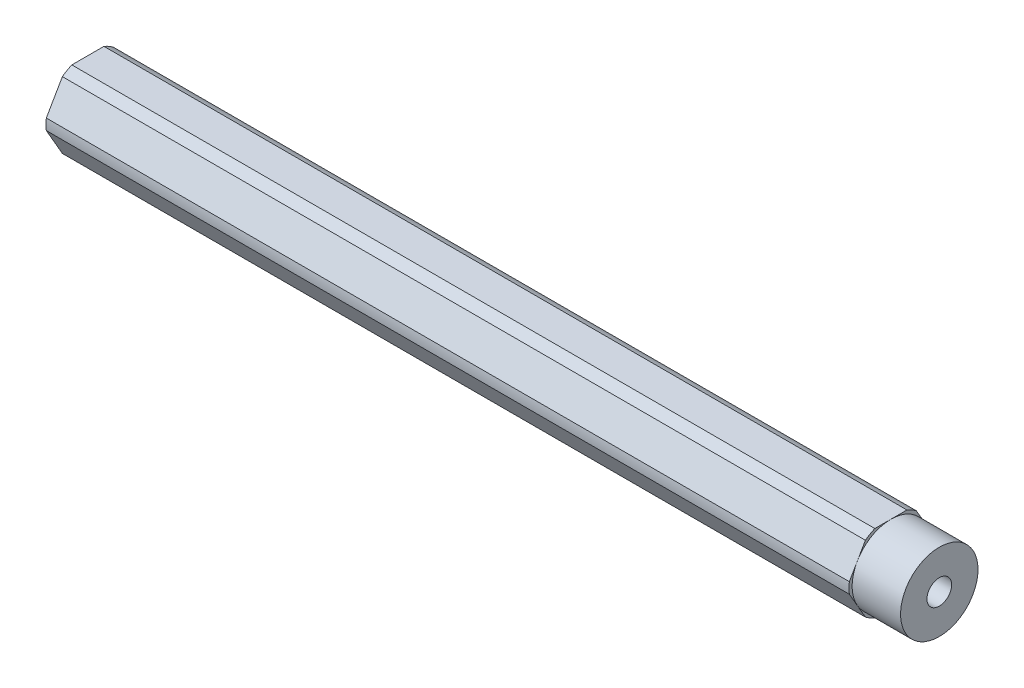
ISO-10303-21;
HEADER;
FILE_DESCRIPTION(('STEP AP214'),'2;1');
FILE_NAME('part.step','',(''),(''),'','','');
FILE_SCHEMA(('AUTOMOTIVE_DESIGN { 1 0 10303 214 1 1 1 1 }'));
ENDSEC;
DATA;
#1=APPLICATION_CONTEXT('core data for automotive mechanical design processes');
#2=APPLICATION_PROTOCOL_DEFINITION('international standard','automotive_design',2000,#1);
#3=PRODUCT_CONTEXT('',#1,'mechanical');
#4=PRODUCT('Part','Part','',(#3));
#5=PRODUCT_RELATED_PRODUCT_CATEGORY('part','',(#4));
#6=PRODUCT_DEFINITION_FORMATION('','',#4);
#7=PRODUCT_DEFINITION_CONTEXT('part definition',#1,'design');
#8=PRODUCT_DEFINITION('design','',#6,#7);
#9=PRODUCT_DEFINITION_SHAPE('','',#8);
#10=(LENGTH_UNIT() NAMED_UNIT(*) SI_UNIT(.MILLI.,.METRE.));
#11=(NAMED_UNIT(*) PLANE_ANGLE_UNIT() SI_UNIT($,.RADIAN.));
#12=(NAMED_UNIT(*) SI_UNIT($,.STERADIAN.) SOLID_ANGLE_UNIT());
#13=UNCERTAINTY_MEASURE_WITH_UNIT(LENGTH_MEASURE(1.E-05),#10,'distance_accuracy_value','');
#14=(GEOMETRIC_REPRESENTATION_CONTEXT(3) GLOBAL_UNCERTAINTY_ASSIGNED_CONTEXT((#13)) GLOBAL_UNIT_ASSIGNED_CONTEXT((#10,
#11,#12)) REPRESENTATION_CONTEXT('',''));
#15=CARTESIAN_POINT('',(0.,0.,0.));
#16=DIRECTION('',(0.,0.,1.));
#17=DIRECTION('',(1.,0.,0.));
#18=AXIS2_PLACEMENT_3D('',#15,#16,#17);
#19=CARTESIAN_POINT('',(69.8246,3.175,-5.49926131403119));
#20=DIRECTION('',(0.,-0.5,0.866025403784438));
#21=DIRECTION('',(0.,-0.866025403784438,-0.5));
#22=AXIS2_PLACEMENT_3D('',#19,#20,#21);
#23=PLANE('',#22);
#24=DIRECTION('',(0.,0.866025403784438,0.5));
#25=VECTOR('',#24,1.);
#26=CARTESIAN_POINT('',(61.8871,3.175,-5.49926131403119));
#27=LINE('',#26,#25);
#28=CARTESIAN_POINT('',(61.8871,0.893039571032185,-6.81675178197583));
#29=VERTEX_POINT('',#28);
#30=CARTESIAN_POINT('',(61.8871,3.175,-5.49926131403119));
#31=VERTEX_POINT('',#30);
#32=EDGE_CURVE('E157',#29,#31,#27,.T.);
#33=ORIENTED_EDGE('',*,*,#32,.F.);
#34=DIRECTION('',(-1.,0.,0.));
#35=VECTOR('',#34,1.);
#36=CARTESIAN_POINT('',(69.8246,0.893039571032185,-6.81675178197583));
#37=LINE('',#36,#35);
#38=CARTESIAN_POINT('',(-69.8246,0.893039571032185,-6.81675178197583));
#39=VERTEX_POINT('',#38);
#40=EDGE_CURVE('E73',#29,#39,#37,.T.);
#41=ORIENTED_EDGE('',*,*,#40,.T.);
#42=DIRECTION('',(0.,0.866025403784438,0.5));
#43=VECTOR('',#42,1.);
#44=CARTESIAN_POINT('',(-69.8246,3.175,-5.49926131403119));
#45=LINE('',#44,#43);
#46=CARTESIAN_POINT('',(-69.8246,5.45696042896782,-4.18177084608654));
#47=VERTEX_POINT('',#46);
#48=EDGE_CURVE('E196',#39,#47,#45,.T.);
#49=ORIENTED_EDGE('',*,*,#48,.T.);
#50=DIRECTION('',(-1.,0.,0.));
#51=VECTOR('',#50,1.);
#52=CARTESIAN_POINT('',(69.8246,5.45696042896782,-4.18177084608654));
#53=LINE('',#52,#51);
#54=CARTESIAN_POINT('',(61.8871,5.45696042896782,-4.18177084608654));
#55=VERTEX_POINT('',#54);
#56=EDGE_CURVE('E185',#55,#47,#53,.T.);
#57=ORIENTED_EDGE('',*,*,#56,.F.);
#58=EDGE_CURVE('E164',#31,#55,#27,.T.);
#59=ORIENTED_EDGE('',*,*,#58,.F.);
#60=EDGE_LOOP('',(#33,#41,#49,#57,#59));
#61=FACE_BOUND('',#60,.T.);
#62=ADVANCED_FACE('F51',(#61),#23,.F.);
#63=CARTESIAN_POINT('',(69.8246,0.,0.));
#64=DIRECTION('',(-1.,0.,0.));
#65=DIRECTION('',(0.,0.,1.));
#66=AXIS2_PLACEMENT_3D('',#63,#64,#65);
#67=CYLINDRICAL_SURFACE('',#66,6.874999966);
#68=CARTESIAN_POINT('',(61.8871,0.,0.));
#69=DIRECTION('',(1.,0.,0.));
#70=DIRECTION('',(0.,0.,-1.));
#71=AXIS2_PLACEMENT_3D('',#68,#69,#70);
#72=CIRCLE('',#71,6.874999966);
#73=CARTESIAN_POINT('',(61.8871,6.35,-2.63498093588929));
#74=VERTEX_POINT('',#73);
#75=EDGE_CURVE('E186',#55,#74,#72,.T.);
#76=ORIENTED_EDGE('',*,*,#75,.F.);
#77=ORIENTED_EDGE('',*,*,#56,.T.);
#78=CARTESIAN_POINT('',(-69.8246,0.,0.));
#79=DIRECTION('',(1.,0.,0.));
#80=DIRECTION('',(0.,0.,-1.));
#81=AXIS2_PLACEMENT_3D('',#78,#79,#80);
#82=CIRCLE('',#81,6.874999966);
#83=CARTESIAN_POINT('',(-69.8246,6.35,-2.63498093588929));
#84=VERTEX_POINT('',#83);
#85=EDGE_CURVE('E198',#47,#84,#82,.T.);
#86=ORIENTED_EDGE('',*,*,#85,.T.);
#87=DIRECTION('',(-1.,0.,0.));
#88=VECTOR('',#87,1.);
#89=CARTESIAN_POINT('',(69.8246,6.35,-2.63498093588929));
#90=LINE('',#89,#88);
#91=EDGE_CURVE('E239',#74,#84,#90,.T.);
#92=ORIENTED_EDGE('',*,*,#91,.F.);
#93=EDGE_LOOP('',(#76,#77,#86,#92));
#94=FACE_BOUND('',#93,.T.);
#95=ADVANCED_FACE('F256',(#94),#67,.T.);
#96=CARTESIAN_POINT('',(69.8246,6.35,0.));
#97=DIRECTION('',(0.,-1.,0.));
#98=DIRECTION('',(0.,0.,-1.));
#99=AXIS2_PLACEMENT_3D('',#96,#97,#98);
#100=PLANE('',#99);
#101=DIRECTION('',(0.,0.,1.));
#102=VECTOR('',#101,1.);
#103=CARTESIAN_POINT('',(61.8871,6.35,0.));
#104=LINE('',#103,#102);
#105=CARTESIAN_POINT('',(61.8871,6.35,0.));
#106=VERTEX_POINT('',#105);
#107=EDGE_CURVE('E181',#74,#106,#104,.T.);
#108=ORIENTED_EDGE('',*,*,#107,.F.);
#109=ORIENTED_EDGE('',*,*,#91,.T.);
#110=DIRECTION('',(0.,0.,1.));
#111=VECTOR('',#110,1.);
#112=CARTESIAN_POINT('',(-69.8246,6.35,0.));
#113=LINE('',#112,#111);
#114=CARTESIAN_POINT('',(-69.8246,6.35,2.63498093588929));
#115=VERTEX_POINT('',#114);
#116=EDGE_CURVE('E201',#84,#115,#113,.T.);
#117=ORIENTED_EDGE('',*,*,#116,.T.);
#118=DIRECTION('',(-1.,0.,0.));
#119=VECTOR('',#118,1.);
#120=CARTESIAN_POINT('',(69.8246,6.35,2.63498093588929));
#121=LINE('',#120,#119);
#122=CARTESIAN_POINT('',(61.8871,6.35,2.63498093588929));
#123=VERTEX_POINT('',#122);
#124=EDGE_CURVE('E237',#123,#115,#121,.T.);
#125=ORIENTED_EDGE('',*,*,#124,.F.);
#126=EDGE_CURVE('E308',#106,#123,#104,.T.);
#127=ORIENTED_EDGE('',*,*,#126,.F.);
#128=EDGE_LOOP('',(#108,#109,#117,#125,#127));
#129=FACE_BOUND('',#128,.T.);
#130=ADVANCED_FACE('F260',(#129),#100,.F.);
#131=CARTESIAN_POINT('',(61.8871,0.,0.));
#132=DIRECTION('',(1.,0.,0.));
#133=DIRECTION('',(0.,0.,-1.));
#134=AXIS2_PLACEMENT_3D('',#131,#132,#133);
#135=CIRCLE('',#134,6.874999966);
#136=CARTESIAN_POINT('',(61.8871,5.45696042896782,4.18177084608655));
#137=VERTEX_POINT('',#136);
#138=EDGE_CURVE('E310',#123,#137,#135,.T.);
#139=ORIENTED_EDGE('',*,*,#138,.F.);
#140=ORIENTED_EDGE('',*,*,#124,.T.);
#141=CARTESIAN_POINT('',(-69.8246,5.45696042896782,4.18177084608655));
#142=VERTEX_POINT('',#141);
#143=EDGE_CURVE('E202',#115,#142,#82,.T.);
#144=ORIENTED_EDGE('',*,*,#143,.T.);
#145=DIRECTION('',(-1.,0.,0.));
#146=VECTOR('',#145,1.);
#147=CARTESIAN_POINT('',(69.8246,5.45696042896782,4.18177084608655));
#148=LINE('',#147,#146);
#149=EDGE_CURVE('E235',#137,#142,#148,.T.);
#150=ORIENTED_EDGE('',*,*,#149,.F.);
#151=EDGE_LOOP('',(#139,#140,#144,#150));
#152=FACE_BOUND('',#151,.T.);
#153=ADVANCED_FACE('F263',(#152),#67,.T.);
#154=CARTESIAN_POINT('',(69.8246,3.175,5.49926131403119));
#155=DIRECTION('',(0.,-0.5,-0.866025403784439));
#156=DIRECTION('',(0.,0.866025403784439,-0.5));
#157=AXIS2_PLACEMENT_3D('',#154,#155,#156);
#158=PLANE('',#157);
#159=DIRECTION('',(0.,-0.866025403784439,0.5));
#160=VECTOR('',#159,1.);
#161=CARTESIAN_POINT('',(61.8871,3.175,5.49926131403119));
#162=LINE('',#161,#160);
#163=CARTESIAN_POINT('',(61.8871,3.175,5.49926131403119));
#164=VERTEX_POINT('',#163);
#165=EDGE_CURVE('E316',#137,#164,#162,.T.);
#166=ORIENTED_EDGE('',*,*,#165,.F.);
#167=ORIENTED_EDGE('',*,*,#149,.T.);
#168=DIRECTION('',(0.,-0.866025403784439,0.5));
#169=VECTOR('',#168,1.);
#170=CARTESIAN_POINT('',(-69.8246,3.175,5.49926131403119));
#171=LINE('',#170,#169);
#172=CARTESIAN_POINT('',(-69.8246,0.893039571032186,6.81675178197583));
#173=VERTEX_POINT('',#172);
#174=EDGE_CURVE('E205',#142,#173,#171,.T.);
#175=ORIENTED_EDGE('',*,*,#174,.T.);
#176=DIRECTION('',(-1.,0.,0.));
#177=VECTOR('',#176,1.);
#178=CARTESIAN_POINT('',(69.8246,0.893039571032186,6.81675178197583));
#179=LINE('',#178,#177);
#180=CARTESIAN_POINT('',(61.8871,0.893039571032186,6.81675178197583));
#181=VERTEX_POINT('',#180);
#182=EDGE_CURVE('E233',#181,#173,#179,.T.);
#183=ORIENTED_EDGE('',*,*,#182,.F.);
#184=EDGE_CURVE('E344',#164,#181,#162,.T.);
#185=ORIENTED_EDGE('',*,*,#184,.F.);
#186=EDGE_LOOP('',(#166,#167,#175,#183,#185));
#187=FACE_BOUND('',#186,.T.);
#188=ADVANCED_FACE('F269',(#187),#158,.F.);
#189=CARTESIAN_POINT('',(61.8871,0.,0.));
#190=DIRECTION('',(1.,0.,0.));
#191=DIRECTION('',(0.,0.,-1.));
#192=AXIS2_PLACEMENT_3D('',#189,#190,#191);
#193=CIRCLE('',#192,6.874999966);
#194=CARTESIAN_POINT('',(61.8871,-0.893039571032186,6.81675178197583));
#195=VERTEX_POINT('',#194);
#196=EDGE_CURVE('E346',#181,#195,#193,.T.);
#197=ORIENTED_EDGE('',*,*,#196,.F.);
#198=ORIENTED_EDGE('',*,*,#182,.T.);
#199=CARTESIAN_POINT('',(-69.8246,-0.893039571032186,6.81675178197583));
#200=VERTEX_POINT('',#199);
#201=EDGE_CURVE('E208',#173,#200,#82,.T.);
#202=ORIENTED_EDGE('',*,*,#201,.T.);
#203=DIRECTION('',(-1.,0.,0.));
#204=VECTOR('',#203,1.);
#205=CARTESIAN_POINT('',(69.8246,-0.893039571032186,6.81675178197583));
#206=LINE('',#205,#204);
#207=EDGE_CURVE('E231',#195,#200,#206,.T.);
#208=ORIENTED_EDGE('',*,*,#207,.F.);
#209=EDGE_LOOP('',(#197,#198,#202,#208));
#210=FACE_BOUND('',#209,.T.);
#211=ADVANCED_FACE('F272',(#210),#67,.T.);
#212=CARTESIAN_POINT('',(69.8246,-3.175,5.49926131403119));
#213=DIRECTION('',(0.,0.5,-0.866025403784438));
#214=DIRECTION('',(0.,0.866025403784439,0.5));
#215=AXIS2_PLACEMENT_3D('',#212,#213,#214);
#216=PLANE('',#215);
#217=DIRECTION('',(0.,-0.866025403784439,-0.5));
#218=VECTOR('',#217,1.);
#219=CARTESIAN_POINT('',(61.8871,-3.175,5.49926131403119));
#220=LINE('',#219,#218);
#221=CARTESIAN_POINT('',(61.8871,-3.175,5.49926131403119));
#222=VERTEX_POINT('',#221);
#223=EDGE_CURVE('E348',#195,#222,#220,.T.);
#224=ORIENTED_EDGE('',*,*,#223,.F.);
#225=ORIENTED_EDGE('',*,*,#207,.T.);
#226=DIRECTION('',(0.,-0.866025403784439,-0.5));
#227=VECTOR('',#226,1.);
#228=CARTESIAN_POINT('',(-69.8246,-3.175,5.49926131403119));
#229=LINE('',#228,#227);
#230=CARTESIAN_POINT('',(-69.8246,-5.45696042896782,4.18177084608655));
#231=VERTEX_POINT('',#230);
#232=EDGE_CURVE('E209',#200,#231,#229,.T.);
#233=ORIENTED_EDGE('',*,*,#232,.T.);
#234=DIRECTION('',(-1.,0.,0.));
#235=VECTOR('',#234,1.);
#236=CARTESIAN_POINT('',(69.8246,-5.45696042896782,4.18177084608655));
#237=LINE('',#236,#235);
#238=CARTESIAN_POINT('',(61.8871,-5.45696042896782,4.18177084608654));
#239=VERTEX_POINT('',#238);
#240=EDGE_CURVE('E229',#239,#231,#237,.T.);
#241=ORIENTED_EDGE('',*,*,#240,.F.);
#242=EDGE_CURVE('E349',#222,#239,#220,.T.);
#243=ORIENTED_EDGE('',*,*,#242,.F.);
#244=EDGE_LOOP('',(#224,#225,#233,#241,#243));
#245=FACE_BOUND('',#244,.T.);
#246=ADVANCED_FACE('F274',(#245),#216,.F.);
#247=CARTESIAN_POINT('',(61.8871,0.,0.));
#248=DIRECTION('',(1.,0.,0.));
#249=DIRECTION('',(0.,0.,-1.));
#250=AXIS2_PLACEMENT_3D('',#247,#248,#249);
#251=CIRCLE('',#250,6.874999966);
#252=CARTESIAN_POINT('',(61.8871,-6.35,2.63498093588928));
#253=VERTEX_POINT('',#252);
#254=EDGE_CURVE('E351',#239,#253,#251,.T.);
#255=ORIENTED_EDGE('',*,*,#254,.F.);
#256=ORIENTED_EDGE('',*,*,#240,.T.);
#257=CARTESIAN_POINT('',(-69.8246,-6.35,2.63498093588928));
#258=VERTEX_POINT('',#257);
#259=EDGE_CURVE('E212',#231,#258,#82,.T.);
#260=ORIENTED_EDGE('',*,*,#259,.T.);
#261=DIRECTION('',(-1.,0.,0.));
#262=VECTOR('',#261,1.);
#263=CARTESIAN_POINT('',(69.8246,-6.35,2.63498093588928));
#264=LINE('',#263,#262);
#265=EDGE_CURVE('E227',#253,#258,#264,.T.);
#266=ORIENTED_EDGE('',*,*,#265,.F.);
#267=EDGE_LOOP('',(#255,#256,#260,#266));
#268=FACE_BOUND('',#267,.T.);
#269=ADVANCED_FACE('F277',(#268),#67,.T.);
#270=CARTESIAN_POINT('',(69.8246,-6.35,0.));
#271=DIRECTION('',(0.,1.,0.));
#272=DIRECTION('',(0.,0.,1.));
#273=AXIS2_PLACEMENT_3D('',#270,#271,#272);
#274=PLANE('',#273);
#275=DIRECTION('',(0.,0.,-1.));
#276=VECTOR('',#275,1.);
#277=CARTESIAN_POINT('',(61.8871,-6.35,0.));
#278=LINE('',#277,#276);
#279=CARTESIAN_POINT('',(61.8871,-6.35,0.));
#280=VERTEX_POINT('',#279);
#281=EDGE_CURVE('E353',#253,#280,#278,.T.);
#282=ORIENTED_EDGE('',*,*,#281,.F.);
#283=ORIENTED_EDGE('',*,*,#265,.T.);
#284=DIRECTION('',(0.,0.,-1.));
#285=VECTOR('',#284,1.);
#286=CARTESIAN_POINT('',(-69.8246,-6.35,0.));
#287=LINE('',#286,#285);
#288=CARTESIAN_POINT('',(-69.8246,-6.35,-2.63498093588928));
#289=VERTEX_POINT('',#288);
#290=EDGE_CURVE('E213',#258,#289,#287,.T.);
#291=ORIENTED_EDGE('',*,*,#290,.T.);
#292=DIRECTION('',(-1.,0.,0.));
#293=VECTOR('',#292,1.);
#294=CARTESIAN_POINT('',(69.8246,-6.35,-2.63498093588928));
#295=LINE('',#294,#293);
#296=CARTESIAN_POINT('',(61.8871,-6.35,-2.63498093588928));
#297=VERTEX_POINT('',#296);
#298=EDGE_CURVE('E225',#297,#289,#295,.T.);
#299=ORIENTED_EDGE('',*,*,#298,.F.);
#300=EDGE_CURVE('E354',#280,#297,#278,.T.);
#301=ORIENTED_EDGE('',*,*,#300,.F.);
#302=EDGE_LOOP('',(#282,#283,#291,#299,#301));
#303=FACE_BOUND('',#302,.T.);
#304=ADVANCED_FACE('F279',(#303),#274,.F.);
#305=CARTESIAN_POINT('',(61.8871,0.,0.));
#306=DIRECTION('',(1.,0.,0.));
#307=DIRECTION('',(0.,0.,-1.));
#308=AXIS2_PLACEMENT_3D('',#305,#306,#307);
#309=CIRCLE('',#308,6.874999966);
#310=CARTESIAN_POINT('',(61.8871,-5.45696042896782,-4.18177084608655));
#311=VERTEX_POINT('',#310);
#312=EDGE_CURVE('E356',#297,#311,#309,.T.);
#313=ORIENTED_EDGE('',*,*,#312,.F.);
#314=ORIENTED_EDGE('',*,*,#298,.T.);
#315=CARTESIAN_POINT('',(-69.8246,-5.45696042896782,-4.18177084608655));
#316=VERTEX_POINT('',#315);
#317=EDGE_CURVE('E216',#289,#316,#82,.T.);
#318=ORIENTED_EDGE('',*,*,#317,.T.);
#319=DIRECTION('',(-1.,0.,0.));
#320=VECTOR('',#319,1.);
#321=CARTESIAN_POINT('',(69.8246,-5.45696042896782,-4.18177084608655));
#322=LINE('',#321,#320);
#323=EDGE_CURVE('E223',#311,#316,#322,.T.);
#324=ORIENTED_EDGE('',*,*,#323,.F.);
#325=EDGE_LOOP('',(#313,#314,#318,#324));
#326=FACE_BOUND('',#325,.T.);
#327=ADVANCED_FACE('F282',(#326),#67,.T.);
#328=CARTESIAN_POINT('',(69.8246,-3.175,-5.49926131403119));
#329=DIRECTION('',(0.,0.5,0.866025403784439));
#330=DIRECTION('',(0.,-0.866025403784439,0.5));
#331=AXIS2_PLACEMENT_3D('',#328,#329,#330);
#332=PLANE('',#331);
#333=DIRECTION('',(0.,0.866025403784439,-0.5));
#334=VECTOR('',#333,1.);
#335=CARTESIAN_POINT('',(61.8871,-3.175,-5.49926131403119));
#336=LINE('',#335,#334);
#337=CARTESIAN_POINT('',(61.8871,-3.175,-5.49926131403119));
#338=VERTEX_POINT('',#337);
#339=EDGE_CURVE('E358',#311,#338,#336,.T.);
#340=ORIENTED_EDGE('',*,*,#339,.F.);
#341=ORIENTED_EDGE('',*,*,#323,.T.);
#342=DIRECTION('',(0.,0.866025403784439,-0.5));
#343=VECTOR('',#342,1.);
#344=CARTESIAN_POINT('',(-69.8246,-3.175,-5.49926131403119));
#345=LINE('',#344,#343);
#346=CARTESIAN_POINT('',(-69.8246,-0.893039571032186,-6.81675178197583));
#347=VERTEX_POINT('',#346);
#348=EDGE_CURVE('E217',#316,#347,#345,.T.);
#349=ORIENTED_EDGE('',*,*,#348,.T.);
#350=DIRECTION('',(-1.,0.,0.));
#351=VECTOR('',#350,1.);
#352=CARTESIAN_POINT('',(69.8246,-0.893039571032186,-6.81675178197583));
#353=LINE('',#352,#351);
#354=CARTESIAN_POINT('',(61.8871,-0.893039571032186,-6.81675178197583));
#355=VERTEX_POINT('',#354);
#356=EDGE_CURVE('E221',#355,#347,#353,.T.);
#357=ORIENTED_EDGE('',*,*,#356,.F.);
#358=EDGE_CURVE('E65',#338,#355,#336,.T.);
#359=ORIENTED_EDGE('',*,*,#358,.F.);
#360=EDGE_LOOP('',(#340,#341,#349,#357,#359));
#361=FACE_BOUND('',#360,.T.);
#362=ADVANCED_FACE('F284',(#361),#332,.F.);
#363=CARTESIAN_POINT('',(61.8871,0.,0.));
#364=DIRECTION('',(1.,0.,0.));
#365=DIRECTION('',(0.,0.,-1.));
#366=AXIS2_PLACEMENT_3D('',#363,#364,#365);
#367=CIRCLE('',#366,6.874999966);
#368=EDGE_CURVE('E12',#355,#29,#367,.T.);
#369=ORIENTED_EDGE('',*,*,#368,.F.);
#370=ORIENTED_EDGE('',*,*,#356,.T.);
#371=EDGE_CURVE('E193',#347,#39,#82,.T.);
#372=ORIENTED_EDGE('',*,*,#371,.T.);
#373=ORIENTED_EDGE('',*,*,#40,.F.);
#374=EDGE_LOOP('',(#369,#370,#372,#373));
#375=FACE_BOUND('',#374,.T.);
#376=ADVANCED_FACE('F264',(#375),#67,.T.);
#377=CARTESIAN_POINT('',(69.8246,0.,0.));
#378=DIRECTION('',(1.,0.,0.));
#379=DIRECTION('',(0.,0.,-1.));
#380=AXIS2_PLACEMENT_3D('',#377,#378,#379);
#381=PLANE('',#380);
#382=CARTESIAN_POINT('',(69.8246,0.,0.));
#383=DIRECTION('',(1.,0.,0.));
#384=DIRECTION('',(0.,0.,-1.));
#385=AXIS2_PLACEMENT_3D('',#382,#383,#384);
#386=CIRCLE('',#385,2.0193);
#387=CARTESIAN_POINT('',(69.8246,0.,-2.0193));
#388=VERTEX_POINT('',#387);
#389=EDGE_CURVE('E190',#388,#388,#386,.T.);
#390=ORIENTED_EDGE('',*,*,#389,.F.);
#391=EDGE_LOOP('',(#390));
#392=FACE_BOUND('',#391,.T.);
#393=CARTESIAN_POINT('',(69.8246,0.,0.));
#394=DIRECTION('',(1.,0.,0.));
#395=DIRECTION('',(0.,0.,-1.));
#396=AXIS2_PLACEMENT_3D('',#393,#394,#395);
#397=CIRCLE('',#396,6.35);
#398=CARTESIAN_POINT('',(69.8246,0.,-6.35));
#399=VERTEX_POINT('',#398);
#400=EDGE_CURVE('E59',#399,#399,#397,.T.);
#401=ORIENTED_EDGE('',*,*,#400,.T.);
#402=EDGE_LOOP('',(#401));
#403=FACE_BOUND('',#402,.T.);
#404=ADVANCED_FACE('F244',(#392,#403),#381,.T.);
#405=CARTESIAN_POINT('',(69.8246,0.,0.));
#406=DIRECTION('',(-1.,0.,0.));
#407=DIRECTION('',(0.,0.,1.));
#408=AXIS2_PLACEMENT_3D('',#405,#406,#407);
#409=CYLINDRICAL_SURFACE('',#408,2.0193);
#410=ORIENTED_EDGE('',*,*,#389,.T.);
#411=EDGE_LOOP('',(#410));
#412=FACE_BOUND('',#411,.T.);
#413=CARTESIAN_POINT('',(-69.8246,0.,0.));
#414=DIRECTION('',(1.,0.,0.));
#415=DIRECTION('',(0.,0.,-1.));
#416=AXIS2_PLACEMENT_3D('',#413,#414,#415);
#417=CIRCLE('',#416,2.0193);
#418=CARTESIAN_POINT('',(-69.8246,0.,-2.0193));
#419=VERTEX_POINT('',#418);
#420=EDGE_CURVE('E163',#419,#419,#417,.T.);
#421=ORIENTED_EDGE('',*,*,#420,.F.);
#422=EDGE_LOOP('',(#421));
#423=FACE_BOUND('',#422,.T.);
#424=ADVANCED_FACE('F53',(#412,#423),#409,.F.);
#425=CARTESIAN_POINT('',(-69.8246,0.,0.));
#426=DIRECTION('',(1.,0.,0.));
#427=DIRECTION('',(0.,0.,-1.));
#428=AXIS2_PLACEMENT_3D('',#425,#426,#427);
#429=PLANE('',#428);
#430=ORIENTED_EDGE('',*,*,#420,.T.);
#431=EDGE_LOOP('',(#430));
#432=FACE_BOUND('',#431,.T.);
#433=ORIENTED_EDGE('',*,*,#48,.F.);
#434=ORIENTED_EDGE('',*,*,#371,.F.);
#435=ORIENTED_EDGE('',*,*,#348,.F.);
#436=ORIENTED_EDGE('',*,*,#317,.F.);
#437=ORIENTED_EDGE('',*,*,#290,.F.);
#438=ORIENTED_EDGE('',*,*,#259,.F.);
#439=ORIENTED_EDGE('',*,*,#232,.F.);
#440=ORIENTED_EDGE('',*,*,#201,.F.);
#441=ORIENTED_EDGE('',*,*,#174,.F.);
#442=ORIENTED_EDGE('',*,*,#143,.F.);
#443=ORIENTED_EDGE('',*,*,#116,.F.);
#444=ORIENTED_EDGE('',*,*,#85,.F.);
#445=EDGE_LOOP('',(#433,#434,#435,#436,#437,#438,#439,#440,#441,#442,#443,#444));
#446=FACE_BOUND('',#445,.T.);
#447=ADVANCED_FACE('F288',(#432,#446),#429,.F.);
#448=CARTESIAN_POINT('',(61.8871,0.,0.));
#449=DIRECTION('',(1.,0.,0.));
#450=DIRECTION('',(0.,0.,-1.));
#451=AXIS2_PLACEMENT_3D('',#448,#449,#450);
#452=PLANE('',#451);
#453=ORIENTED_EDGE('',*,*,#32,.T.);
#454=CARTESIAN_POINT('',(61.8871,0.,0.));
#455=DIRECTION('',(1.,0.,0.));
#456=DIRECTION('',(0.,0.,-1.));
#457=AXIS2_PLACEMENT_3D('',#454,#455,#456);
#458=CIRCLE('',#457,6.35);
#459=EDGE_CURVE('E160',#338,#31,#458,.T.);
#460=ORIENTED_EDGE('',*,*,#459,.F.);
#461=ORIENTED_EDGE('',*,*,#358,.T.);
#462=ORIENTED_EDGE('',*,*,#368,.T.);
#463=EDGE_LOOP('',(#453,#460,#461,#462));
#464=FACE_BOUND('',#463,.T.);
#465=ADVANCED_FACE('F159',(#464),#452,.T.);
#466=ORIENTED_EDGE('',*,*,#58,.T.);
#467=ORIENTED_EDGE('',*,*,#75,.T.);
#468=ORIENTED_EDGE('',*,*,#107,.T.);
#469=EDGE_CURVE('E171',#31,#106,#458,.T.);
#470=ORIENTED_EDGE('',*,*,#469,.F.);
#471=EDGE_LOOP('',(#466,#467,#468,#470));
#472=FACE_BOUND('',#471,.T.);
#473=ADVANCED_FACE('F178',(#472),#452,.T.);
#474=ORIENTED_EDGE('',*,*,#126,.T.);
#475=ORIENTED_EDGE('',*,*,#138,.T.);
#476=ORIENTED_EDGE('',*,*,#165,.T.);
#477=EDGE_CURVE('E183',#106,#164,#458,.T.);
#478=ORIENTED_EDGE('',*,*,#477,.F.);
#479=EDGE_LOOP('',(#474,#475,#476,#478));
#480=FACE_BOUND('',#479,.T.);
#481=ADVANCED_FACE('F298',(#480),#452,.T.);
#482=ORIENTED_EDGE('',*,*,#184,.T.);
#483=ORIENTED_EDGE('',*,*,#196,.T.);
#484=ORIENTED_EDGE('',*,*,#223,.T.);
#485=EDGE_CURVE('E372',#164,#222,#458,.T.);
#486=ORIENTED_EDGE('',*,*,#485,.F.);
#487=EDGE_LOOP('',(#482,#483,#484,#486));
#488=FACE_BOUND('',#487,.T.);
#489=ADVANCED_FACE('F302',(#488),#452,.T.);
#490=ORIENTED_EDGE('',*,*,#242,.T.);
#491=ORIENTED_EDGE('',*,*,#254,.T.);
#492=ORIENTED_EDGE('',*,*,#281,.T.);
#493=EDGE_CURVE('E374',#222,#280,#458,.T.);
#494=ORIENTED_EDGE('',*,*,#493,.F.);
#495=EDGE_LOOP('',(#490,#491,#492,#494));
#496=FACE_BOUND('',#495,.T.);
#497=ADVANCED_FACE('F252',(#496),#452,.T.);
#498=ORIENTED_EDGE('',*,*,#300,.T.);
#499=ORIENTED_EDGE('',*,*,#312,.T.);
#500=ORIENTED_EDGE('',*,*,#339,.T.);
#501=EDGE_CURVE('E175',#280,#338,#458,.T.);
#502=ORIENTED_EDGE('',*,*,#501,.F.);
#503=EDGE_LOOP('',(#498,#499,#500,#502));
#504=FACE_BOUND('',#503,.T.);
#505=ADVANCED_FACE('F247',(#504),#452,.T.);
#506=CARTESIAN_POINT('',(61.8871,0.,0.));
#507=DIRECTION('',(1.,0.,0.));
#508=DIRECTION('',(0.,0.,-1.));
#509=AXIS2_PLACEMENT_3D('',#506,#507,#508);
#510=CYLINDRICAL_SURFACE('',#509,6.35);
#511=ORIENTED_EDGE('',*,*,#400,.F.);
#512=EDGE_LOOP('',(#511));
#513=FACE_BOUND('',#512,.T.);
#514=ORIENTED_EDGE('',*,*,#459,.T.);
#515=ORIENTED_EDGE('',*,*,#469,.T.);
#516=ORIENTED_EDGE('',*,*,#477,.T.);
#517=ORIENTED_EDGE('',*,*,#485,.T.);
#518=ORIENTED_EDGE('',*,*,#493,.T.);
#519=ORIENTED_EDGE('',*,*,#501,.T.);
#520=EDGE_LOOP('',(#514,#515,#516,#517,#518,#519));
#521=FACE_BOUND('',#520,.T.);
#522=ADVANCED_FACE('F169',(#513,#521),#510,.T.);
#523=CLOSED_SHELL('',(#62,#95,#130,#153,#188,#211,#246,#269,#304,#327,#362,#376,#404,#424,#447,
#465,#473,#481,#489,#497,#505,#522));
#524=MANIFOLD_SOLID_BREP('B2',#523);
#525=ADVANCED_BREP_SHAPE_REPRESENTATION('',(#18,#524),#14);
#526=SHAPE_DEFINITION_REPRESENTATION(#9,#525);
ENDSEC;
END-ISO-10303-21;
